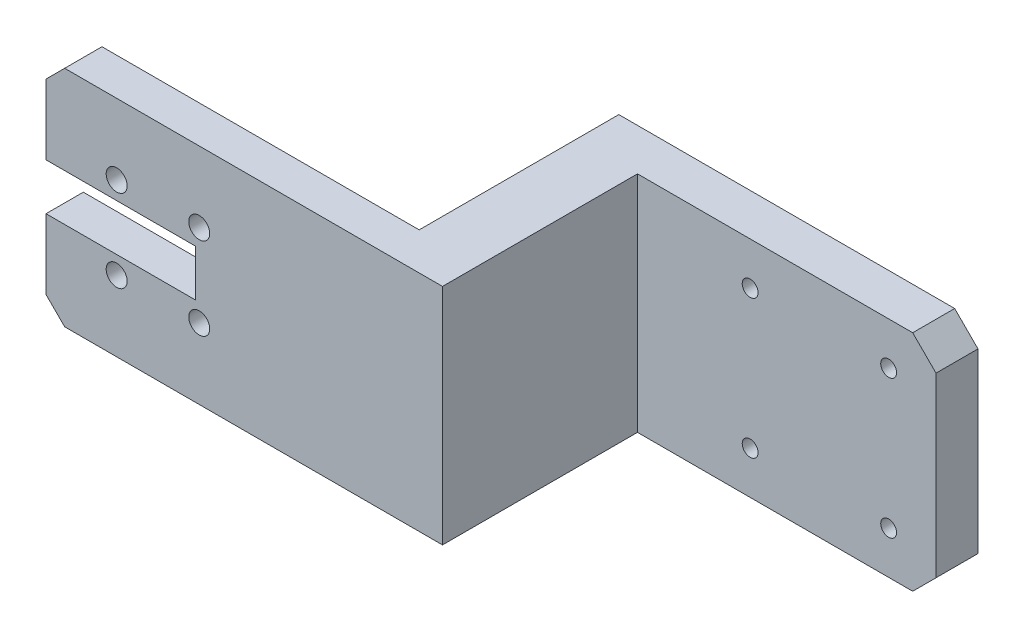
ISO-10303-21;
HEADER;
FILE_DESCRIPTION(('STEP AP214'),'2;1');
FILE_NAME('part.step','',(''),(''),'','','');
FILE_SCHEMA(('AUTOMOTIVE_DESIGN { 1 0 10303 214 1 1 1 1 }'));
ENDSEC;
DATA;
#1=APPLICATION_CONTEXT('core data for automotive mechanical design processes');
#2=APPLICATION_PROTOCOL_DEFINITION('international standard','automotive_design',2000,#1);
#3=PRODUCT_CONTEXT('',#1,'mechanical');
#4=PRODUCT('Part','Part','',(#3));
#5=PRODUCT_RELATED_PRODUCT_CATEGORY('part','',(#4));
#6=PRODUCT_DEFINITION_FORMATION('','',#4);
#7=PRODUCT_DEFINITION_CONTEXT('part definition',#1,'design');
#8=PRODUCT_DEFINITION('design','',#6,#7);
#9=PRODUCT_DEFINITION_SHAPE('','',#8);
#10=(LENGTH_UNIT() NAMED_UNIT(*) SI_UNIT(.MILLI.,.METRE.));
#11=(NAMED_UNIT(*) PLANE_ANGLE_UNIT() SI_UNIT($,.RADIAN.));
#12=(NAMED_UNIT(*) SI_UNIT($,.STERADIAN.) SOLID_ANGLE_UNIT());
#13=UNCERTAINTY_MEASURE_WITH_UNIT(LENGTH_MEASURE(1.E-05),#10,'distance_accuracy_value','');
#14=(GEOMETRIC_REPRESENTATION_CONTEXT(3) GLOBAL_UNCERTAINTY_ASSIGNED_CONTEXT((#13)) GLOBAL_UNIT_ASSIGNED_CONTEXT((#10,
#11,#12)) REPRESENTATION_CONTEXT('',''));
#15=CARTESIAN_POINT('',(0.,0.,0.));
#16=DIRECTION('',(0.,0.,1.));
#17=DIRECTION('',(1.,0.,0.));
#18=AXIS2_PLACEMENT_3D('',#15,#16,#17);
#19=CARTESIAN_POINT('',(0.,0.,0.));
#20=DIRECTION('',(0.,0.,1.));
#21=DIRECTION('',(1.,0.,0.));
#22=AXIS2_PLACEMENT_3D('',#19,#20,#21);
#23=PLANE('',#22);
#24=DIRECTION('',(0.,-1.,0.));
#25=VECTOR('',#24,1.);
#26=CARTESIAN_POINT('',(48.,24.,0.));
#27=LINE('',#26,#25);
#28=CARTESIAN_POINT('',(48.,24.,0.));
#29=VERTEX_POINT('',#28);
#30=CARTESIAN_POINT('',(48.,-24.,0.));
#31=VERTEX_POINT('',#30);
#32=EDGE_CURVE('E254',#29,#31,#27,.T.);
#33=ORIENTED_EDGE('',*,*,#32,.F.);
#34=DIRECTION('',(-1.,0.,0.));
#35=VECTOR('',#34,1.);
#36=CARTESIAN_POINT('',(120.,24.,0.));
#37=LINE('',#36,#35);
#38=CARTESIAN_POINT('',(120.,24.,0.));
#39=VERTEX_POINT('',#38);
#40=EDGE_CURVE('E60',#39,#29,#37,.T.);
#41=ORIENTED_EDGE('',*,*,#40,.F.);
#42=DIRECTION('',(-0.707106781186548,0.707106781186547,0.));
#43=VECTOR('',#42,1.);
#44=CARTESIAN_POINT('',(125.,19.,0.));
#45=LINE('',#44,#43);
#46=CARTESIAN_POINT('',(125.,19.,0.));
#47=VERTEX_POINT('',#46);
#48=EDGE_CURVE('E263',#47,#39,#45,.T.);
#49=ORIENTED_EDGE('',*,*,#48,.F.);
#50=DIRECTION('',(0.,1.,0.));
#51=VECTOR('',#50,1.);
#52=CARTESIAN_POINT('',(125.,-19.,0.));
#53=LINE('',#52,#51);
#54=CARTESIAN_POINT('',(125.,-19.,0.));
#55=VERTEX_POINT('',#54);
#56=EDGE_CURVE('E261',#55,#47,#53,.T.);
#57=ORIENTED_EDGE('',*,*,#56,.F.);
#58=DIRECTION('',(0.707106781186548,0.707106781186547,0.));
#59=VECTOR('',#58,1.);
#60=CARTESIAN_POINT('',(120.,-24.,0.));
#61=LINE('',#60,#59);
#62=CARTESIAN_POINT('',(120.,-24.,0.));
#63=VERTEX_POINT('',#62);
#64=EDGE_CURVE('E259',#63,#55,#61,.T.);
#65=ORIENTED_EDGE('',*,*,#64,.F.);
#66=DIRECTION('',(1.,0.,0.));
#67=VECTOR('',#66,1.);
#68=CARTESIAN_POINT('',(48.,-24.,0.));
#69=LINE('',#68,#67);
#70=EDGE_CURVE('E257',#31,#63,#69,.T.);
#71=ORIENTED_EDGE('',*,*,#70,.F.);
#72=EDGE_LOOP('',(#33,#41,#49,#57,#65,#71));
#73=FACE_BOUND('',#72,.T.);
#74=CARTESIAN_POINT('',(85.155,-14.845,0.));
#75=DIRECTION('',(0.,0.,1.));
#76=DIRECTION('',(1.,0.,0.));
#77=AXIS2_PLACEMENT_3D('',#74,#75,#76);
#78=CIRCLE('',#77,3.75);
#79=CARTESIAN_POINT('',(88.905,-14.845,0.));
#80=VERTEX_POINT('',#79);
#81=EDGE_CURVE('E249',#80,#80,#78,.T.);
#82=ORIENTED_EDGE('',*,*,#81,.T.);
#83=EDGE_LOOP('',(#82));
#84=FACE_BOUND('',#83,.T.);
#85=CARTESIAN_POINT('',(85.155,14.845,0.));
#86=DIRECTION('',(0.,0.,1.));
#87=DIRECTION('',(1.,0.,0.));
#88=AXIS2_PLACEMENT_3D('',#85,#86,#87);
#89=CIRCLE('',#88,3.75);
#90=CARTESIAN_POINT('',(88.905,14.845,0.));
#91=VERTEX_POINT('',#90);
#92=EDGE_CURVE('E244',#91,#91,#89,.T.);
#93=ORIENTED_EDGE('',*,*,#92,.T.);
#94=EDGE_LOOP('',(#93));
#95=FACE_BOUND('',#94,.T.);
#96=CARTESIAN_POINT('',(114.845,-14.845,0.));
#97=DIRECTION('',(0.,0.,1.));
#98=DIRECTION('',(1.,0.,0.));
#99=AXIS2_PLACEMENT_3D('',#96,#97,#98);
#100=CIRCLE('',#99,3.75);
#101=CARTESIAN_POINT('',(118.595,-14.845,0.));
#102=VERTEX_POINT('',#101);
#103=EDGE_CURVE('E237',#102,#102,#100,.T.);
#104=ORIENTED_EDGE('',*,*,#103,.T.);
#105=EDGE_LOOP('',(#104));
#106=FACE_BOUND('',#105,.T.);
#107=CARTESIAN_POINT('',(114.845,14.845,0.));
#108=DIRECTION('',(0.,0.,1.));
#109=DIRECTION('',(1.,0.,0.));
#110=AXIS2_PLACEMENT_3D('',#107,#108,#109);
#111=CIRCLE('',#110,3.75);
#112=CARTESIAN_POINT('',(118.595,14.845,0.));
#113=VERTEX_POINT('',#112);
#114=EDGE_CURVE('E234',#113,#113,#111,.T.);
#115=ORIENTED_EDGE('',*,*,#114,.T.);
#116=EDGE_LOOP('',(#115));
#117=FACE_BOUND('',#116,.T.);
#118=ADVANCED_FACE('F37',(#73,#84,#95,#106,#117),#23,.F.);
#119=CARTESIAN_POINT('',(48.,24.,4.));
#120=DIRECTION('',(1.,0.,0.));
#121=DIRECTION('',(0.,0.,-1.));
#122=AXIS2_PLACEMENT_3D('',#119,#120,#121);
#123=PLANE('',#122);
#124=ORIENTED_EDGE('',*,*,#32,.T.);
#125=DIRECTION('',(0.,0.,-1.));
#126=VECTOR('',#125,1.);
#127=CARTESIAN_POINT('',(48.,-24.,4.));
#128=LINE('',#127,#126);
#129=CARTESIAN_POINT('',(48.,-24.,42.8));
#130=VERTEX_POINT('',#129);
#131=EDGE_CURVE('E11',#130,#31,#128,.T.);
#132=ORIENTED_EDGE('',*,*,#131,.F.);
#133=DIRECTION('',(0.,-1.,0.));
#134=VECTOR('',#133,1.);
#135=CARTESIAN_POINT('',(48.,24.,42.8));
#136=LINE('',#135,#134);
#137=CARTESIAN_POINT('',(48.,24.,42.8));
#138=VERTEX_POINT('',#137);
#139=EDGE_CURVE('E179',#138,#130,#136,.T.);
#140=ORIENTED_EDGE('',*,*,#139,.F.);
#141=DIRECTION('',(0.,0.,-1.));
#142=VECTOR('',#141,1.);
#143=CARTESIAN_POINT('',(48.,24.,4.));
#144=LINE('',#143,#142);
#145=EDGE_CURVE('E266',#138,#29,#144,.T.);
#146=ORIENTED_EDGE('',*,*,#145,.T.);
#147=EDGE_LOOP('',(#124,#132,#140,#146));
#148=FACE_BOUND('',#147,.T.);
#149=ADVANCED_FACE('F39',(#148),#123,.F.);
#150=CARTESIAN_POINT('',(48.,-24.,4.));
#151=DIRECTION('',(0.,1.,0.));
#152=DIRECTION('',(0.,0.,1.));
#153=AXIS2_PLACEMENT_3D('',#150,#151,#152);
#154=PLANE('',#153);
#155=ORIENTED_EDGE('',*,*,#70,.T.);
#156=DIRECTION('',(0.,0.,-1.));
#157=VECTOR('',#156,1.);
#158=CARTESIAN_POINT('',(120.,-24.,4.));
#159=LINE('',#158,#157);
#160=CARTESIAN_POINT('',(120.,-24.,9.));
#161=VERTEX_POINT('',#160);
#162=EDGE_CURVE('E45',#161,#63,#159,.T.);
#163=ORIENTED_EDGE('',*,*,#162,.F.);
#164=DIRECTION('',(1.,0.,0.));
#165=VECTOR('',#164,1.);
#166=CARTESIAN_POINT('',(48.,-24.,9.));
#167=LINE('',#166,#165);
#168=CARTESIAN_POINT('',(61.,-24.,9.));
#169=VERTEX_POINT('',#168);
#170=EDGE_CURVE('E215',#169,#161,#167,.T.);
#171=ORIENTED_EDGE('',*,*,#170,.F.);
#172=DIRECTION('',(0.,0.,-1.));
#173=VECTOR('',#172,1.);
#174=CARTESIAN_POINT('',(61.,-24.,42.8));
#175=LINE('',#174,#173);
#176=CARTESIAN_POINT('',(61.,-24.,50.8));
#177=VERTEX_POINT('',#176);
#178=EDGE_CURVE('E190',#177,#169,#175,.T.);
#179=ORIENTED_EDGE('',*,*,#178,.F.);
#180=DIRECTION('',(1.,0.,0.));
#181=VECTOR('',#180,1.);
#182=CARTESIAN_POINT('',(-20.,-24.,50.8));
#183=LINE('',#182,#181);
#184=CARTESIAN_POINT('',(-20.,-24.,50.8));
#185=VERTEX_POINT('',#184);
#186=EDGE_CURVE('E162',#185,#177,#183,.T.);
#187=ORIENTED_EDGE('',*,*,#186,.F.);
#188=DIRECTION('',(0.,0.,-1.));
#189=VECTOR('',#188,1.);
#190=CARTESIAN_POINT('',(-20.,-24.,50.8));
#191=LINE('',#190,#189);
#192=CARTESIAN_POINT('',(-20.,-24.,42.8));
#193=VERTEX_POINT('',#192);
#194=EDGE_CURVE('E158',#185,#193,#191,.T.);
#195=ORIENTED_EDGE('',*,*,#194,.T.);
#196=DIRECTION('',(1.,0.,0.));
#197=VECTOR('',#196,1.);
#198=CARTESIAN_POINT('',(-20.,-24.,42.8));
#199=LINE('',#198,#197);
#200=EDGE_CURVE('E323',#193,#130,#199,.T.);
#201=ORIENTED_EDGE('',*,*,#200,.T.);
#202=ORIENTED_EDGE('',*,*,#131,.T.);
#203=EDGE_LOOP('',(#155,#163,#171,#179,#187,#195,#201,#202));
#204=FACE_BOUND('',#203,.T.);
#205=ADVANCED_FACE('F377',(#204),#154,.F.);
#206=CARTESIAN_POINT('',(120.,-24.,4.));
#207=DIRECTION('',(-0.707106781186547,0.707106781186548,0.));
#208=DIRECTION('',(-0.707106781186548,-0.707106781186547,0.));
#209=AXIS2_PLACEMENT_3D('',#206,#207,#208);
#210=PLANE('',#209);
#211=ORIENTED_EDGE('',*,*,#64,.T.);
#212=DIRECTION('',(0.,0.,-1.));
#213=VECTOR('',#212,1.);
#214=CARTESIAN_POINT('',(125.,-19.,4.));
#215=LINE('',#214,#213);
#216=CARTESIAN_POINT('',(125.,-19.,9.));
#217=VERTEX_POINT('',#216);
#218=EDGE_CURVE('E273',#217,#55,#215,.T.);
#219=ORIENTED_EDGE('',*,*,#218,.F.);
#220=DIRECTION('',(0.707106781186548,0.707106781186547,0.));
#221=VECTOR('',#220,1.);
#222=CARTESIAN_POINT('',(120.,-24.,9.));
#223=LINE('',#222,#221);
#224=EDGE_CURVE('E219',#161,#217,#223,.T.);
#225=ORIENTED_EDGE('',*,*,#224,.F.);
#226=ORIENTED_EDGE('',*,*,#162,.T.);
#227=EDGE_LOOP('',(#211,#219,#225,#226));
#228=FACE_BOUND('',#227,.T.);
#229=ADVANCED_FACE('F280',(#228),#210,.F.);
#230=CARTESIAN_POINT('',(125.,-19.,4.));
#231=DIRECTION('',(-1.,0.,0.));
#232=DIRECTION('',(0.,0.,1.));
#233=AXIS2_PLACEMENT_3D('',#230,#231,#232);
#234=PLANE('',#233);
#235=ORIENTED_EDGE('',*,*,#56,.T.);
#236=DIRECTION('',(0.,0.,-1.));
#237=VECTOR('',#236,1.);
#238=CARTESIAN_POINT('',(125.,19.,4.));
#239=LINE('',#238,#237);
#240=CARTESIAN_POINT('',(125.,19.,9.));
#241=VERTEX_POINT('',#240);
#242=EDGE_CURVE('E270',#241,#47,#239,.T.);
#243=ORIENTED_EDGE('',*,*,#242,.F.);
#244=DIRECTION('',(0.,1.,0.));
#245=VECTOR('',#244,1.);
#246=CARTESIAN_POINT('',(125.,-19.,9.));
#247=LINE('',#246,#245);
#248=EDGE_CURVE('E222',#217,#241,#247,.T.);
#249=ORIENTED_EDGE('',*,*,#248,.F.);
#250=ORIENTED_EDGE('',*,*,#218,.T.);
#251=EDGE_LOOP('',(#235,#243,#249,#250));
#252=FACE_BOUND('',#251,.T.);
#253=ADVANCED_FACE('F288',(#252),#234,.F.);
#254=CARTESIAN_POINT('',(125.,19.,4.));
#255=DIRECTION('',(-0.707106781186547,-0.707106781186548,0.));
#256=DIRECTION('',(0.707106781186548,-0.707106781186547,0.));
#257=AXIS2_PLACEMENT_3D('',#254,#255,#256);
#258=PLANE('',#257);
#259=ORIENTED_EDGE('',*,*,#48,.T.);
#260=DIRECTION('',(0.,0.,-1.));
#261=VECTOR('',#260,1.);
#262=CARTESIAN_POINT('',(120.,24.,4.));
#263=LINE('',#262,#261);
#264=CARTESIAN_POINT('',(120.,24.,9.));
#265=VERTEX_POINT('',#264);
#266=EDGE_CURVE('E268',#265,#39,#263,.T.);
#267=ORIENTED_EDGE('',*,*,#266,.F.);
#268=DIRECTION('',(-0.707106781186548,0.707106781186547,0.));
#269=VECTOR('',#268,1.);
#270=CARTESIAN_POINT('',(125.,19.,9.));
#271=LINE('',#270,#269);
#272=EDGE_CURVE('E225',#241,#265,#271,.T.);
#273=ORIENTED_EDGE('',*,*,#272,.F.);
#274=ORIENTED_EDGE('',*,*,#242,.T.);
#275=EDGE_LOOP('',(#259,#267,#273,#274));
#276=FACE_BOUND('',#275,.T.);
#277=ADVANCED_FACE('F292',(#276),#258,.F.);
#278=CARTESIAN_POINT('',(120.,24.,4.));
#279=DIRECTION('',(0.,-1.,0.));
#280=DIRECTION('',(0.,0.,-1.));
#281=AXIS2_PLACEMENT_3D('',#278,#279,#280);
#282=PLANE('',#281);
#283=ORIENTED_EDGE('',*,*,#40,.T.);
#284=ORIENTED_EDGE('',*,*,#145,.F.);
#285=DIRECTION('',(-1.,0.,0.));
#286=VECTOR('',#285,1.);
#287=CARTESIAN_POINT('',(61.,24.,42.8));
#288=LINE('',#287,#286);
#289=CARTESIAN_POINT('',(-20.,24.,42.8));
#290=VERTEX_POINT('',#289);
#291=EDGE_CURVE('E326',#138,#290,#288,.T.);
#292=ORIENTED_EDGE('',*,*,#291,.T.);
#293=DIRECTION('',(0.,0.,-1.));
#294=VECTOR('',#293,1.);
#295=CARTESIAN_POINT('',(-20.,24.,50.8));
#296=LINE('',#295,#294);
#297=CARTESIAN_POINT('',(-20.,24.,50.8));
#298=VERTEX_POINT('',#297);
#299=EDGE_CURVE('E181',#298,#290,#296,.T.);
#300=ORIENTED_EDGE('',*,*,#299,.F.);
#301=DIRECTION('',(-1.,0.,0.));
#302=VECTOR('',#301,1.);
#303=CARTESIAN_POINT('',(61.,24.,50.8));
#304=LINE('',#303,#302);
#305=CARTESIAN_POINT('',(61.,24.,50.8));
#306=VERTEX_POINT('',#305);
#307=EDGE_CURVE('E299',#306,#298,#304,.T.);
#308=ORIENTED_EDGE('',*,*,#307,.F.);
#309=DIRECTION('',(0.,0.,-1.));
#310=VECTOR('',#309,1.);
#311=CARTESIAN_POINT('',(61.,24.,42.8));
#312=LINE('',#311,#310);
#313=CARTESIAN_POINT('',(61.,24.,9.));
#314=VERTEX_POINT('',#313);
#315=EDGE_CURVE('E186',#306,#314,#312,.T.);
#316=ORIENTED_EDGE('',*,*,#315,.T.);
#317=DIRECTION('',(-1.,0.,0.));
#318=VECTOR('',#317,1.);
#319=CARTESIAN_POINT('',(120.,24.,9.));
#320=LINE('',#319,#318);
#321=EDGE_CURVE('E228',#265,#314,#320,.T.);
#322=ORIENTED_EDGE('',*,*,#321,.F.);
#323=ORIENTED_EDGE('',*,*,#266,.T.);
#324=EDGE_LOOP('',(#283,#284,#292,#300,#308,#316,#322,#323));
#325=FACE_BOUND('',#324,.T.);
#326=ADVANCED_FACE('F296',(#325),#282,.F.);
#327=CARTESIAN_POINT('',(85.155,-14.845,4.));
#328=DIRECTION('',(0.,0.,-1.));
#329=DIRECTION('',(-1.,0.,0.));
#330=AXIS2_PLACEMENT_3D('',#327,#328,#329);
#331=CYLINDRICAL_SURFACE('',#330,3.75);
#332=CARTESIAN_POINT('',(85.155,-14.845,4.));
#333=DIRECTION('',(0.,0.,1.));
#334=DIRECTION('',(1.,0.,0.));
#335=AXIS2_PLACEMENT_3D('',#332,#333,#334);
#336=CIRCLE('',#335,3.75);
#337=CARTESIAN_POINT('',(88.905,-14.845,4.));
#338=VERTEX_POINT('',#337);
#339=EDGE_CURVE('E241',#338,#338,#336,.T.);
#340=ORIENTED_EDGE('',*,*,#339,.T.);
#341=EDGE_LOOP('',(#340));
#342=FACE_BOUND('',#341,.T.);
#343=ORIENTED_EDGE('',*,*,#81,.F.);
#344=EDGE_LOOP('',(#343));
#345=FACE_BOUND('',#344,.T.);
#346=ADVANCED_FACE('F390',(#342,#345),#331,.F.);
#347=CARTESIAN_POINT('',(85.155,14.845,4.));
#348=DIRECTION('',(0.,0.,-1.));
#349=DIRECTION('',(-1.,0.,0.));
#350=AXIS2_PLACEMENT_3D('',#347,#348,#349);
#351=CYLINDRICAL_SURFACE('',#350,3.75);
#352=CARTESIAN_POINT('',(85.155,14.845,4.));
#353=DIRECTION('',(0.,0.,1.));
#354=DIRECTION('',(1.,0.,0.));
#355=AXIS2_PLACEMENT_3D('',#352,#353,#354);
#356=CIRCLE('',#355,3.75);
#357=CARTESIAN_POINT('',(88.905,14.845,4.));
#358=VERTEX_POINT('',#357);
#359=EDGE_CURVE('E233',#358,#358,#356,.T.);
#360=ORIENTED_EDGE('',*,*,#359,.T.);
#361=EDGE_LOOP('',(#360));
#362=FACE_BOUND('',#361,.T.);
#363=ORIENTED_EDGE('',*,*,#92,.F.);
#364=EDGE_LOOP('',(#363));
#365=FACE_BOUND('',#364,.T.);
#366=ADVANCED_FACE('F424',(#362,#365),#351,.F.);
#367=CARTESIAN_POINT('',(114.845,-14.845,4.));
#368=DIRECTION('',(0.,0.,-1.));
#369=DIRECTION('',(-1.,0.,0.));
#370=AXIS2_PLACEMENT_3D('',#367,#368,#369);
#371=CYLINDRICAL_SURFACE('',#370,3.75);
#372=CARTESIAN_POINT('',(114.845,-14.845,4.));
#373=DIRECTION('',(0.,0.,1.));
#374=DIRECTION('',(1.,0.,0.));
#375=AXIS2_PLACEMENT_3D('',#372,#373,#374);
#376=CIRCLE('',#375,3.75);
#377=CARTESIAN_POINT('',(118.595,-14.845,4.));
#378=VERTEX_POINT('',#377);
#379=EDGE_CURVE('E238',#378,#378,#376,.T.);
#380=ORIENTED_EDGE('',*,*,#379,.T.);
#381=EDGE_LOOP('',(#380));
#382=FACE_BOUND('',#381,.T.);
#383=ORIENTED_EDGE('',*,*,#103,.F.);
#384=EDGE_LOOP('',(#383));
#385=FACE_BOUND('',#384,.T.);
#386=ADVANCED_FACE('F431',(#382,#385),#371,.F.);
#387=CARTESIAN_POINT('',(114.845,14.845,4.));
#388=DIRECTION('',(0.,0.,-1.));
#389=DIRECTION('',(-1.,0.,0.));
#390=AXIS2_PLACEMENT_3D('',#387,#388,#389);
#391=CYLINDRICAL_SURFACE('',#390,3.75);
#392=CARTESIAN_POINT('',(114.845,14.845,4.));
#393=DIRECTION('',(0.,0.,1.));
#394=DIRECTION('',(1.,0.,0.));
#395=AXIS2_PLACEMENT_3D('',#392,#393,#394);
#396=CIRCLE('',#395,3.75);
#397=CARTESIAN_POINT('',(118.595,14.845,4.));
#398=VERTEX_POINT('',#397);
#399=EDGE_CURVE('E230',#398,#398,#396,.T.);
#400=ORIENTED_EDGE('',*,*,#399,.T.);
#401=EDGE_LOOP('',(#400));
#402=FACE_BOUND('',#401,.T.);
#403=ORIENTED_EDGE('',*,*,#114,.F.);
#404=EDGE_LOOP('',(#403));
#405=FACE_BOUND('',#404,.T.);
#406=ADVANCED_FACE('F438',(#402,#405),#391,.F.);
#407=CARTESIAN_POINT('',(0.,0.,4.));
#408=DIRECTION('',(0.,0.,1.));
#409=DIRECTION('',(1.,0.,0.));
#410=AXIS2_PLACEMENT_3D('',#407,#408,#409);
#411=PLANE('',#410);
#412=CARTESIAN_POINT('',(114.845,-14.845,4.));
#413=DIRECTION('',(0.,0.,1.));
#414=DIRECTION('',(1.,0.,0.));
#415=AXIS2_PLACEMENT_3D('',#412,#413,#414);
#416=CIRCLE('',#415,1.69999999999999);
#417=CARTESIAN_POINT('',(116.545,-14.845,4.));
#418=VERTEX_POINT('',#417);
#419=EDGE_CURVE('E197',#418,#418,#416,.T.);
#420=ORIENTED_EDGE('',*,*,#419,.T.);
#421=EDGE_LOOP('',(#420));
#422=FACE_BOUND('',#421,.T.);
#423=ORIENTED_EDGE('',*,*,#379,.F.);
#424=EDGE_LOOP('',(#423));
#425=FACE_BOUND('',#424,.T.);
#426=ADVANCED_FACE('F445',(#422,#425),#411,.F.);
#427=CARTESIAN_POINT('',(85.155,-14.845,4.));
#428=DIRECTION('',(0.,0.,1.));
#429=DIRECTION('',(1.,0.,0.));
#430=AXIS2_PLACEMENT_3D('',#427,#428,#429);
#431=CIRCLE('',#430,1.69999999999999);
#432=CARTESIAN_POINT('',(86.855,-14.845,4.));
#433=VERTEX_POINT('',#432);
#434=EDGE_CURVE('E209',#433,#433,#431,.T.);
#435=ORIENTED_EDGE('',*,*,#434,.T.);
#436=EDGE_LOOP('',(#435));
#437=FACE_BOUND('',#436,.T.);
#438=ORIENTED_EDGE('',*,*,#339,.F.);
#439=EDGE_LOOP('',(#438));
#440=FACE_BOUND('',#439,.T.);
#441=ADVANCED_FACE('F452',(#437,#440),#411,.F.);
#442=CARTESIAN_POINT('',(85.155,14.845,4.));
#443=DIRECTION('',(0.,0.,1.));
#444=DIRECTION('',(1.,0.,0.));
#445=AXIS2_PLACEMENT_3D('',#442,#443,#444);
#446=CIRCLE('',#445,1.69999999999999);
#447=CARTESIAN_POINT('',(86.855,14.845,4.));
#448=VERTEX_POINT('',#447);
#449=EDGE_CURVE('E203',#448,#448,#446,.T.);
#450=ORIENTED_EDGE('',*,*,#449,.T.);
#451=EDGE_LOOP('',(#450));
#452=FACE_BOUND('',#451,.T.);
#453=ORIENTED_EDGE('',*,*,#359,.F.);
#454=EDGE_LOOP('',(#453));
#455=FACE_BOUND('',#454,.T.);
#456=ADVANCED_FACE('F461',(#452,#455),#411,.F.);
#457=CARTESIAN_POINT('',(114.845,14.845,4.));
#458=DIRECTION('',(0.,0.,1.));
#459=DIRECTION('',(1.,0.,0.));
#460=AXIS2_PLACEMENT_3D('',#457,#458,#459);
#461=CIRCLE('',#460,1.69999999999999);
#462=CARTESIAN_POINT('',(116.545,14.845,4.));
#463=VERTEX_POINT('',#462);
#464=EDGE_CURVE('E193',#463,#463,#461,.T.);
#465=ORIENTED_EDGE('',*,*,#464,.T.);
#466=EDGE_LOOP('',(#465));
#467=FACE_BOUND('',#466,.T.);
#468=ORIENTED_EDGE('',*,*,#399,.F.);
#469=EDGE_LOOP('',(#468));
#470=FACE_BOUND('',#469,.T.);
#471=ADVANCED_FACE('F455',(#467,#470),#411,.F.);
#472=CARTESIAN_POINT('',(0.,0.,9.));
#473=DIRECTION('',(0.,0.,1.));
#474=DIRECTION('',(1.,0.,0.));
#475=AXIS2_PLACEMENT_3D('',#472,#473,#474);
#476=PLANE('',#475);
#477=DIRECTION('',(0.,1.,0.));
#478=VECTOR('',#477,1.);
#479=CARTESIAN_POINT('',(61.,-24.,9.));
#480=LINE('',#479,#478);
#481=EDGE_CURVE('E52',#169,#314,#480,.T.);
#482=ORIENTED_EDGE('',*,*,#481,.F.);
#483=ORIENTED_EDGE('',*,*,#170,.T.);
#484=ORIENTED_EDGE('',*,*,#224,.T.);
#485=ORIENTED_EDGE('',*,*,#248,.T.);
#486=ORIENTED_EDGE('',*,*,#272,.T.);
#487=ORIENTED_EDGE('',*,*,#321,.T.);
#488=EDGE_LOOP('',(#482,#483,#484,#485,#486,#487));
#489=FACE_BOUND('',#488,.T.);
#490=CARTESIAN_POINT('',(114.845,-14.845,9.));
#491=DIRECTION('',(0.,0.,1.));
#492=DIRECTION('',(1.,0.,0.));
#493=AXIS2_PLACEMENT_3D('',#490,#491,#492);
#494=CIRCLE('',#493,1.69999999999999);
#495=CARTESIAN_POINT('',(116.545,-14.845,9.));
#496=VERTEX_POINT('',#495);
#497=EDGE_CURVE('E200',#496,#496,#494,.T.);
#498=ORIENTED_EDGE('',*,*,#497,.F.);
#499=EDGE_LOOP('',(#498));
#500=FACE_BOUND('',#499,.T.);
#501=CARTESIAN_POINT('',(85.155,-14.845,9.));
#502=DIRECTION('',(0.,0.,1.));
#503=DIRECTION('',(1.,0.,0.));
#504=AXIS2_PLACEMENT_3D('',#501,#502,#503);
#505=CIRCLE('',#504,1.69999999999999);
#506=CARTESIAN_POINT('',(86.855,-14.845,9.));
#507=VERTEX_POINT('',#506);
#508=EDGE_CURVE('E212',#507,#507,#505,.T.);
#509=ORIENTED_EDGE('',*,*,#508,.F.);
#510=EDGE_LOOP('',(#509));
#511=FACE_BOUND('',#510,.T.);
#512=CARTESIAN_POINT('',(85.155,14.845,9.));
#513=DIRECTION('',(0.,0.,1.));
#514=DIRECTION('',(1.,0.,0.));
#515=AXIS2_PLACEMENT_3D('',#512,#513,#514);
#516=CIRCLE('',#515,1.69999999999999);
#517=CARTESIAN_POINT('',(86.855,14.845,9.));
#518=VERTEX_POINT('',#517);
#519=EDGE_CURVE('E206',#518,#518,#516,.T.);
#520=ORIENTED_EDGE('',*,*,#519,.F.);
#521=EDGE_LOOP('',(#520));
#522=FACE_BOUND('',#521,.T.);
#523=CARTESIAN_POINT('',(114.845,14.845,9.));
#524=DIRECTION('',(0.,0.,1.));
#525=DIRECTION('',(1.,0.,0.));
#526=AXIS2_PLACEMENT_3D('',#523,#524,#525);
#527=CIRCLE('',#526,1.69999999999999);
#528=CARTESIAN_POINT('',(116.545,14.845,9.));
#529=VERTEX_POINT('',#528);
#530=EDGE_CURVE('E194',#529,#529,#527,.T.);
#531=ORIENTED_EDGE('',*,*,#530,.F.);
#532=EDGE_LOOP('',(#531));
#533=FACE_BOUND('',#532,.T.);
#534=ADVANCED_FACE('F294',(#489,#500,#511,#522,#533),#476,.T.);
#535=CARTESIAN_POINT('',(85.155,-14.845,9.));
#536=DIRECTION('',(0.,0.,-1.));
#537=DIRECTION('',(-1.,0.,0.));
#538=AXIS2_PLACEMENT_3D('',#535,#536,#537);
#539=CYLINDRICAL_SURFACE('',#538,1.69999999999999);
#540=ORIENTED_EDGE('',*,*,#508,.T.);
#541=EDGE_LOOP('',(#540));
#542=FACE_BOUND('',#541,.T.);
#543=ORIENTED_EDGE('',*,*,#434,.F.);
#544=EDGE_LOOP('',(#543));
#545=FACE_BOUND('',#544,.T.);
#546=ADVANCED_FACE('F481',(#542,#545),#539,.F.);
#547=CARTESIAN_POINT('',(85.155,14.845,9.));
#548=DIRECTION('',(0.,0.,-1.));
#549=DIRECTION('',(-1.,0.,0.));
#550=AXIS2_PLACEMENT_3D('',#547,#548,#549);
#551=CYLINDRICAL_SURFACE('',#550,1.69999999999999);
#552=ORIENTED_EDGE('',*,*,#519,.T.);
#553=EDGE_LOOP('',(#552));
#554=FACE_BOUND('',#553,.T.);
#555=ORIENTED_EDGE('',*,*,#449,.F.);
#556=EDGE_LOOP('',(#555));
#557=FACE_BOUND('',#556,.T.);
#558=ADVANCED_FACE('F488',(#554,#557),#551,.F.);
#559=CARTESIAN_POINT('',(114.845,-14.845,9.));
#560=DIRECTION('',(0.,0.,-1.));
#561=DIRECTION('',(-1.,0.,0.));
#562=AXIS2_PLACEMENT_3D('',#559,#560,#561);
#563=CYLINDRICAL_SURFACE('',#562,1.69999999999999);
#564=ORIENTED_EDGE('',*,*,#497,.T.);
#565=EDGE_LOOP('',(#564));
#566=FACE_BOUND('',#565,.T.);
#567=ORIENTED_EDGE('',*,*,#419,.F.);
#568=EDGE_LOOP('',(#567));
#569=FACE_BOUND('',#568,.T.);
#570=ADVANCED_FACE('F496',(#566,#569),#563,.F.);
#571=CARTESIAN_POINT('',(114.845,14.845,9.));
#572=DIRECTION('',(0.,0.,-1.));
#573=DIRECTION('',(-1.,0.,0.));
#574=AXIS2_PLACEMENT_3D('',#571,#572,#573);
#575=CYLINDRICAL_SURFACE('',#574,1.69999999999999);
#576=ORIENTED_EDGE('',*,*,#530,.T.);
#577=EDGE_LOOP('',(#576));
#578=FACE_BOUND('',#577,.T.);
#579=ORIENTED_EDGE('',*,*,#464,.F.);
#580=EDGE_LOOP('',(#579));
#581=FACE_BOUND('',#580,.T.);
#582=ADVANCED_FACE('F504',(#578,#581),#575,.F.);
#583=CARTESIAN_POINT('',(61.,-24.,42.8));
#584=DIRECTION('',(-1.,0.,0.));
#585=DIRECTION('',(0.,0.,1.));
#586=AXIS2_PLACEMENT_3D('',#583,#584,#585);
#587=PLANE('',#586);
#588=ORIENTED_EDGE('',*,*,#481,.T.);
#589=ORIENTED_EDGE('',*,*,#315,.F.);
#590=DIRECTION('',(0.,1.,0.));
#591=VECTOR('',#590,1.);
#592=CARTESIAN_POINT('',(61.,-24.,50.8));
#593=LINE('',#592,#591);
#594=EDGE_CURVE('E304',#177,#306,#593,.T.);
#595=ORIENTED_EDGE('',*,*,#594,.F.);
#596=ORIENTED_EDGE('',*,*,#178,.T.);
#597=EDGE_LOOP('',(#588,#589,#595,#596));
#598=FACE_BOUND('',#597,.T.);
#599=ADVANCED_FACE('F303',(#598),#587,.F.);
#600=CARTESIAN_POINT('',(0.,0.,42.8));
#601=DIRECTION('',(0.,0.,1.));
#602=DIRECTION('',(1.,0.,0.));
#603=AXIS2_PLACEMENT_3D('',#600,#601,#602);
#604=PLANE('',#603);
#605=CARTESIAN_POINT('',(-8.85,-8.85,42.8));
#606=DIRECTION('',(0.,0.,1.));
#607=DIRECTION('',(1.,0.,0.));
#608=AXIS2_PLACEMENT_3D('',#605,#606,#607);
#609=CIRCLE('',#608,2.25);
#610=CARTESIAN_POINT('',(-6.6,-8.85,42.8));
#611=VERTEX_POINT('',#610);
#612=EDGE_CURVE('E738',#611,#611,#609,.T.);
#613=ORIENTED_EDGE('',*,*,#612,.T.);
#614=EDGE_LOOP('',(#613));
#615=FACE_BOUND('',#614,.T.);
#616=CARTESIAN_POINT('',(-8.85,8.85,42.8));
#617=DIRECTION('',(0.,0.,1.));
#618=DIRECTION('',(1.,0.,0.));
#619=AXIS2_PLACEMENT_3D('',#616,#617,#618);
#620=CIRCLE('',#619,2.25);
#621=CARTESIAN_POINT('',(-6.6,8.85,42.8));
#622=VERTEX_POINT('',#621);
#623=EDGE_CURVE('E732',#622,#622,#620,.T.);
#624=ORIENTED_EDGE('',*,*,#623,.T.);
#625=EDGE_LOOP('',(#624));
#626=FACE_BOUND('',#625,.T.);
#627=CARTESIAN_POINT('',(8.85,-8.85,42.8));
#628=DIRECTION('',(0.,0.,1.));
#629=DIRECTION('',(1.,0.,0.));
#630=AXIS2_PLACEMENT_3D('',#627,#628,#629);
#631=CIRCLE('',#630,2.25);
#632=CARTESIAN_POINT('',(11.1,-8.85,42.8));
#633=VERTEX_POINT('',#632);
#634=EDGE_CURVE('E726',#633,#633,#631,.T.);
#635=ORIENTED_EDGE('',*,*,#634,.T.);
#636=EDGE_LOOP('',(#635));
#637=FACE_BOUND('',#636,.T.);
#638=CARTESIAN_POINT('',(8.85,8.85,42.8));
#639=DIRECTION('',(0.,0.,1.));
#640=DIRECTION('',(1.,0.,0.));
#641=AXIS2_PLACEMENT_3D('',#638,#639,#640);
#642=CIRCLE('',#641,2.25);
#643=CARTESIAN_POINT('',(11.1,8.85,42.8));
#644=VERTEX_POINT('',#643);
#645=EDGE_CURVE('E723',#644,#644,#642,.T.);
#646=ORIENTED_EDGE('',*,*,#645,.T.);
#647=EDGE_LOOP('',(#646));
#648=FACE_BOUND('',#647,.T.);
#649=ORIENTED_EDGE('',*,*,#291,.F.);
#650=ORIENTED_EDGE('',*,*,#139,.T.);
#651=ORIENTED_EDGE('',*,*,#200,.F.);
#652=DIRECTION('',(0.707106781186548,-0.707106781186548,0.));
#653=VECTOR('',#652,1.);
#654=CARTESIAN_POINT('',(-24.,-20.,42.8));
#655=LINE('',#654,#653);
#656=CARTESIAN_POINT('',(-24.,-20.,42.8));
#657=VERTEX_POINT('',#656);
#658=EDGE_CURVE('E320',#657,#193,#655,.T.);
#659=ORIENTED_EDGE('',*,*,#658,.F.);
#660=DIRECTION('',(0.,-1.,0.));
#661=VECTOR('',#660,1.);
#662=CARTESIAN_POINT('',(-24.,-5.,42.8));
#663=LINE('',#662,#661);
#664=CARTESIAN_POINT('',(-24.,-5.,42.8));
#665=VERTEX_POINT('',#664);
#666=EDGE_CURVE('E177',#665,#657,#663,.T.);
#667=ORIENTED_EDGE('',*,*,#666,.F.);
#668=DIRECTION('',(-1.,0.,0.));
#669=VECTOR('',#668,1.);
#670=CARTESIAN_POINT('',(8.,-5.,42.8));
#671=LINE('',#670,#669);
#672=CARTESIAN_POINT('',(8.,-5.,42.8));
#673=VERTEX_POINT('',#672);
#674=EDGE_CURVE('E173',#673,#665,#671,.T.);
#675=ORIENTED_EDGE('',*,*,#674,.F.);
#676=DIRECTION('',(0.,-1.,0.));
#677=VECTOR('',#676,1.);
#678=CARTESIAN_POINT('',(8.,5.,42.8));
#679=LINE('',#678,#677);
#680=CARTESIAN_POINT('',(8.,5.,42.8));
#681=VERTEX_POINT('',#680);
#682=EDGE_CURVE('E334',#681,#673,#679,.T.);
#683=ORIENTED_EDGE('',*,*,#682,.F.);
#684=DIRECTION('',(1.,0.,0.));
#685=VECTOR('',#684,1.);
#686=CARTESIAN_POINT('',(-24.,5.,42.8));
#687=LINE('',#686,#685);
#688=CARTESIAN_POINT('',(-24.,5.,42.8));
#689=VERTEX_POINT('',#688);
#690=EDGE_CURVE('E332',#689,#681,#687,.T.);
#691=ORIENTED_EDGE('',*,*,#690,.F.);
#692=DIRECTION('',(0.,-1.,0.));
#693=VECTOR('',#692,1.);
#694=CARTESIAN_POINT('',(-24.,20.,42.8));
#695=LINE('',#694,#693);
#696=CARTESIAN_POINT('',(-24.,20.,42.8));
#697=VERTEX_POINT('',#696);
#698=EDGE_CURVE('E330',#697,#689,#695,.T.);
#699=ORIENTED_EDGE('',*,*,#698,.F.);
#700=DIRECTION('',(-0.707106781186548,-0.707106781186548,0.));
#701=VECTOR('',#700,1.);
#702=CARTESIAN_POINT('',(-20.,24.,42.8));
#703=LINE('',#702,#701);
#704=EDGE_CURVE('E328',#290,#697,#703,.T.);
#705=ORIENTED_EDGE('',*,*,#704,.F.);
#706=EDGE_LOOP('',(#649,#650,#651,#659,#667,#675,#683,#691,#699,#705));
#707=FACE_BOUND('',#706,.T.);
#708=ADVANCED_FACE('F358',(#615,#626,#637,#648,#707),#604,.F.);
#709=CARTESIAN_POINT('',(0.,0.,50.8));
#710=DIRECTION('',(0.,0.,1.));
#711=DIRECTION('',(1.,0.,0.));
#712=AXIS2_PLACEMENT_3D('',#709,#710,#711);
#713=PLANE('',#712);
#714=CARTESIAN_POINT('',(8.85,-8.85,50.8));
#715=DIRECTION('',(0.,0.,1.));
#716=DIRECTION('',(1.,0.,0.));
#717=AXIS2_PLACEMENT_3D('',#714,#715,#716);
#718=CIRCLE('',#717,2.25);
#719=CARTESIAN_POINT('',(11.1,-8.85,50.8));
#720=VERTEX_POINT('',#719);
#721=EDGE_CURVE('E729',#720,#720,#718,.T.);
#722=ORIENTED_EDGE('',*,*,#721,.F.);
#723=EDGE_LOOP('',(#722));
#724=FACE_BOUND('',#723,.T.);
#725=CARTESIAN_POINT('',(-8.85,-8.85,50.8));
#726=DIRECTION('',(0.,0.,1.));
#727=DIRECTION('',(1.,0.,0.));
#728=AXIS2_PLACEMENT_3D('',#725,#726,#727);
#729=CIRCLE('',#728,2.25);
#730=CARTESIAN_POINT('',(-6.6,-8.85,50.8));
#731=VERTEX_POINT('',#730);
#732=EDGE_CURVE('E321',#731,#731,#729,.T.);
#733=ORIENTED_EDGE('',*,*,#732,.F.);
#734=EDGE_LOOP('',(#733));
#735=FACE_BOUND('',#734,.T.);
#736=DIRECTION('',(0.,-1.,0.));
#737=VECTOR('',#736,1.);
#738=CARTESIAN_POINT('',(-24.,-5.,50.8));
#739=LINE('',#738,#737);
#740=CARTESIAN_POINT('',(-24.,-5.,50.8));
#741=VERTEX_POINT('',#740);
#742=CARTESIAN_POINT('',(-24.,-20.,50.8));
#743=VERTEX_POINT('',#742);
#744=EDGE_CURVE('E163',#741,#743,#739,.T.);
#745=ORIENTED_EDGE('',*,*,#744,.T.);
#746=DIRECTION('',(0.707106781186548,-0.707106781186548,0.));
#747=VECTOR('',#746,1.);
#748=CARTESIAN_POINT('',(-24.,-20.,50.8));
#749=LINE('',#748,#747);
#750=EDGE_CURVE('E151',#743,#185,#749,.T.);
#751=ORIENTED_EDGE('',*,*,#750,.T.);
#752=ORIENTED_EDGE('',*,*,#186,.T.);
#753=ORIENTED_EDGE('',*,*,#594,.T.);
#754=ORIENTED_EDGE('',*,*,#307,.T.);
#755=DIRECTION('',(-0.707106781186548,-0.707106781186548,0.));
#756=VECTOR('',#755,1.);
#757=CARTESIAN_POINT('',(-20.,24.,50.8));
#758=LINE('',#757,#756);
#759=CARTESIAN_POINT('',(-24.,20.,50.8));
#760=VERTEX_POINT('',#759);
#761=EDGE_CURVE('E306',#298,#760,#758,.T.);
#762=ORIENTED_EDGE('',*,*,#761,.T.);
#763=DIRECTION('',(0.,-1.,0.));
#764=VECTOR('',#763,1.);
#765=CARTESIAN_POINT('',(-24.,20.,50.8));
#766=LINE('',#765,#764);
#767=CARTESIAN_POINT('',(-24.,5.,50.8));
#768=VERTEX_POINT('',#767);
#769=EDGE_CURVE('E311',#760,#768,#766,.T.);
#770=ORIENTED_EDGE('',*,*,#769,.T.);
#771=DIRECTION('',(1.,0.,0.));
#772=VECTOR('',#771,1.);
#773=CARTESIAN_POINT('',(-24.,5.,50.8));
#774=LINE('',#773,#772);
#775=CARTESIAN_POINT('',(8.,5.,50.8));
#776=VERTEX_POINT('',#775);
#777=EDGE_CURVE('E313',#768,#776,#774,.T.);
#778=ORIENTED_EDGE('',*,*,#777,.T.);
#779=DIRECTION('',(0.,-1.,0.));
#780=VECTOR('',#779,1.);
#781=CARTESIAN_POINT('',(8.,5.,50.8));
#782=LINE('',#781,#780);
#783=CARTESIAN_POINT('',(8.,-5.,50.8));
#784=VERTEX_POINT('',#783);
#785=EDGE_CURVE('E315',#776,#784,#782,.T.);
#786=ORIENTED_EDGE('',*,*,#785,.T.);
#787=DIRECTION('',(-1.,0.,0.));
#788=VECTOR('',#787,1.);
#789=CARTESIAN_POINT('',(8.,-5.,50.8));
#790=LINE('',#789,#788);
#791=EDGE_CURVE('E169',#784,#741,#790,.T.);
#792=ORIENTED_EDGE('',*,*,#791,.T.);
#793=EDGE_LOOP('',(#745,#751,#752,#753,#754,#762,#770,#778,#786,#792));
#794=FACE_BOUND('',#793,.T.);
#795=CARTESIAN_POINT('',(-8.85,8.85,50.8));
#796=DIRECTION('',(0.,0.,1.));
#797=DIRECTION('',(1.,0.,0.));
#798=AXIS2_PLACEMENT_3D('',#795,#796,#797);
#799=CIRCLE('',#798,2.25);
#800=CARTESIAN_POINT('',(-6.6,8.85,50.8));
#801=VERTEX_POINT('',#800);
#802=EDGE_CURVE('E735',#801,#801,#799,.T.);
#803=ORIENTED_EDGE('',*,*,#802,.F.);
#804=EDGE_LOOP('',(#803));
#805=FACE_BOUND('',#804,.T.);
#806=CARTESIAN_POINT('',(8.85,8.85,50.8));
#807=DIRECTION('',(0.,0.,1.));
#808=DIRECTION('',(1.,0.,0.));
#809=AXIS2_PLACEMENT_3D('',#806,#807,#808);
#810=CIRCLE('',#809,2.25);
#811=CARTESIAN_POINT('',(11.1,8.85,50.8));
#812=VERTEX_POINT('',#811);
#813=EDGE_CURVE('E720',#812,#812,#810,.T.);
#814=ORIENTED_EDGE('',*,*,#813,.F.);
#815=EDGE_LOOP('',(#814));
#816=FACE_BOUND('',#815,.T.);
#817=ADVANCED_FACE('F166',(#724,#735,#794,#805,#816),#713,.T.);
#818=CARTESIAN_POINT('',(-24.,-5.,50.8));
#819=DIRECTION('',(1.,0.,0.));
#820=DIRECTION('',(0.,0.,-1.));
#821=AXIS2_PLACEMENT_3D('',#818,#819,#820);
#822=PLANE('',#821);
#823=ORIENTED_EDGE('',*,*,#666,.T.);
#824=DIRECTION('',(0.,0.,-1.));
#825=VECTOR('',#824,1.);
#826=CARTESIAN_POINT('',(-24.,-20.,50.8));
#827=LINE('',#826,#825);
#828=EDGE_CURVE('E155',#743,#657,#827,.T.);
#829=ORIENTED_EDGE('',*,*,#828,.F.);
#830=ORIENTED_EDGE('',*,*,#744,.F.);
#831=DIRECTION('',(0.,0.,-1.));
#832=VECTOR('',#831,1.);
#833=CARTESIAN_POINT('',(-24.,-5.,50.8));
#834=LINE('',#833,#832);
#835=EDGE_CURVE('E318',#741,#665,#834,.T.);
#836=ORIENTED_EDGE('',*,*,#835,.T.);
#837=EDGE_LOOP('',(#823,#829,#830,#836));
#838=FACE_BOUND('',#837,.T.);
#839=ADVANCED_FACE('F175',(#838),#822,.F.);
#840=CARTESIAN_POINT('',(-24.,-20.,50.8));
#841=DIRECTION('',(0.707106781186547,0.707106781186547,0.));
#842=DIRECTION('',(-0.707106781186548,0.707106781186548,0.));
#843=AXIS2_PLACEMENT_3D('',#840,#841,#842);
#844=PLANE('',#843);
#845=ORIENTED_EDGE('',*,*,#658,.T.);
#846=ORIENTED_EDGE('',*,*,#194,.F.);
#847=ORIENTED_EDGE('',*,*,#750,.F.);
#848=ORIENTED_EDGE('',*,*,#828,.T.);
#849=EDGE_LOOP('',(#845,#846,#847,#848));
#850=FACE_BOUND('',#849,.T.);
#851=ADVANCED_FACE('F153',(#850),#844,.F.);
#852=CARTESIAN_POINT('',(-20.,24.,50.8));
#853=DIRECTION('',(0.707106781186547,-0.707106781186547,0.));
#854=DIRECTION('',(0.707106781186548,0.707106781186548,0.));
#855=AXIS2_PLACEMENT_3D('',#852,#853,#854);
#856=PLANE('',#855);
#857=ORIENTED_EDGE('',*,*,#704,.T.);
#858=DIRECTION('',(0.,0.,-1.));
#859=VECTOR('',#858,1.);
#860=CARTESIAN_POINT('',(-24.,20.,50.8));
#861=LINE('',#860,#859);
#862=EDGE_CURVE('E347',#760,#697,#861,.T.);
#863=ORIENTED_EDGE('',*,*,#862,.F.);
#864=ORIENTED_EDGE('',*,*,#761,.F.);
#865=ORIENTED_EDGE('',*,*,#299,.T.);
#866=EDGE_LOOP('',(#857,#863,#864,#865));
#867=FACE_BOUND('',#866,.T.);
#868=ADVANCED_FACE('F353',(#867),#856,.F.);
#869=CARTESIAN_POINT('',(-24.,20.,50.8));
#870=DIRECTION('',(1.,0.,0.));
#871=DIRECTION('',(0.,0.,-1.));
#872=AXIS2_PLACEMENT_3D('',#869,#870,#871);
#873=PLANE('',#872);
#874=ORIENTED_EDGE('',*,*,#698,.T.);
#875=DIRECTION('',(0.,0.,-1.));
#876=VECTOR('',#875,1.);
#877=CARTESIAN_POINT('',(-24.,5.,50.8));
#878=LINE('',#877,#876);
#879=EDGE_CURVE('E344',#768,#689,#878,.T.);
#880=ORIENTED_EDGE('',*,*,#879,.F.);
#881=ORIENTED_EDGE('',*,*,#769,.F.);
#882=ORIENTED_EDGE('',*,*,#862,.T.);
#883=EDGE_LOOP('',(#874,#880,#881,#882));
#884=FACE_BOUND('',#883,.T.);
#885=ADVANCED_FACE('F363',(#884),#873,.F.);
#886=CARTESIAN_POINT('',(-24.,5.,50.8));
#887=DIRECTION('',(0.,1.,0.));
#888=DIRECTION('',(0.,0.,1.));
#889=AXIS2_PLACEMENT_3D('',#886,#887,#888);
#890=PLANE('',#889);
#891=ORIENTED_EDGE('',*,*,#690,.T.);
#892=DIRECTION('',(0.,0.,-1.));
#893=VECTOR('',#892,1.);
#894=CARTESIAN_POINT('',(8.,5.,50.8));
#895=LINE('',#894,#893);
#896=EDGE_CURVE('E341',#776,#681,#895,.T.);
#897=ORIENTED_EDGE('',*,*,#896,.F.);
#898=ORIENTED_EDGE('',*,*,#777,.F.);
#899=ORIENTED_EDGE('',*,*,#879,.T.);
#900=EDGE_LOOP('',(#891,#897,#898,#899));
#901=FACE_BOUND('',#900,.T.);
#902=ADVANCED_FACE('F367',(#901),#890,.F.);
#903=CARTESIAN_POINT('',(8.,5.,50.8));
#904=DIRECTION('',(1.,0.,0.));
#905=DIRECTION('',(0.,0.,-1.));
#906=AXIS2_PLACEMENT_3D('',#903,#904,#905);
#907=PLANE('',#906);
#908=ORIENTED_EDGE('',*,*,#682,.T.);
#909=DIRECTION('',(0.,0.,-1.));
#910=VECTOR('',#909,1.);
#911=CARTESIAN_POINT('',(8.,-5.,50.8));
#912=LINE('',#911,#910);
#913=EDGE_CURVE('E338',#784,#673,#912,.T.);
#914=ORIENTED_EDGE('',*,*,#913,.F.);
#915=ORIENTED_EDGE('',*,*,#785,.F.);
#916=ORIENTED_EDGE('',*,*,#896,.T.);
#917=EDGE_LOOP('',(#908,#914,#915,#916));
#918=FACE_BOUND('',#917,.T.);
#919=ADVANCED_FACE('F372',(#918),#907,.F.);
#920=CARTESIAN_POINT('',(8.,-5.,50.8));
#921=DIRECTION('',(0.,-1.,0.));
#922=DIRECTION('',(0.,0.,-1.));
#923=AXIS2_PLACEMENT_3D('',#920,#921,#922);
#924=PLANE('',#923);
#925=ORIENTED_EDGE('',*,*,#674,.T.);
#926=ORIENTED_EDGE('',*,*,#835,.F.);
#927=ORIENTED_EDGE('',*,*,#791,.F.);
#928=ORIENTED_EDGE('',*,*,#913,.T.);
#929=EDGE_LOOP('',(#925,#926,#927,#928));
#930=FACE_BOUND('',#929,.T.);
#931=ADVANCED_FACE('F375',(#930),#924,.F.);
#932=CARTESIAN_POINT('',(-8.85,-8.85,50.8));
#933=DIRECTION('',(0.,0.,-1.));
#934=DIRECTION('',(-1.,0.,0.));
#935=AXIS2_PLACEMENT_3D('',#932,#933,#934);
#936=CYLINDRICAL_SURFACE('',#935,2.25);
#937=ORIENTED_EDGE('',*,*,#732,.T.);
#938=EDGE_LOOP('',(#937));
#939=FACE_BOUND('',#938,.T.);
#940=ORIENTED_EDGE('',*,*,#612,.F.);
#941=EDGE_LOOP('',(#940));
#942=FACE_BOUND('',#941,.T.);
#943=ADVANCED_FACE('F573',(#939,#942),#936,.F.);
#944=CARTESIAN_POINT('',(-8.85,8.85,50.8));
#945=DIRECTION('',(0.,0.,-1.));
#946=DIRECTION('',(-1.,0.,0.));
#947=AXIS2_PLACEMENT_3D('',#944,#945,#946);
#948=CYLINDRICAL_SURFACE('',#947,2.25);
#949=ORIENTED_EDGE('',*,*,#802,.T.);
#950=EDGE_LOOP('',(#949));
#951=FACE_BOUND('',#950,.T.);
#952=ORIENTED_EDGE('',*,*,#623,.F.);
#953=EDGE_LOOP('',(#952));
#954=FACE_BOUND('',#953,.T.);
#955=ADVANCED_FACE('F580',(#951,#954),#948,.F.);
#956=CARTESIAN_POINT('',(8.85,-8.85,50.8));
#957=DIRECTION('',(0.,0.,-1.));
#958=DIRECTION('',(-1.,0.,0.));
#959=AXIS2_PLACEMENT_3D('',#956,#957,#958);
#960=CYLINDRICAL_SURFACE('',#959,2.25);
#961=ORIENTED_EDGE('',*,*,#721,.T.);
#962=EDGE_LOOP('',(#961));
#963=FACE_BOUND('',#962,.T.);
#964=ORIENTED_EDGE('',*,*,#634,.F.);
#965=EDGE_LOOP('',(#964));
#966=FACE_BOUND('',#965,.T.);
#967=ADVANCED_FACE('F588',(#963,#966),#960,.F.);
#968=CARTESIAN_POINT('',(8.85,8.85,50.8));
#969=DIRECTION('',(0.,0.,-1.));
#970=DIRECTION('',(-1.,0.,0.));
#971=AXIS2_PLACEMENT_3D('',#968,#969,#970);
#972=CYLINDRICAL_SURFACE('',#971,2.25);
#973=ORIENTED_EDGE('',*,*,#813,.T.);
#974=EDGE_LOOP('',(#973));
#975=FACE_BOUND('',#974,.T.);
#976=ORIENTED_EDGE('',*,*,#645,.F.);
#977=EDGE_LOOP('',(#976));
#978=FACE_BOUND('',#977,.T.);
#979=ADVANCED_FACE('F596',(#975,#978),#972,.F.);
#980=CLOSED_SHELL('',(#118,#149,#205,#229,#253,#277,#326,#346,#366,#386,#406,#426,#441,#456,
#471,#534,#546,#558,#570,#582,#599,#708,#817,#839,#851,#868,#885,#902,#919,#931,#943,#955,#967,#979));
#981=MANIFOLD_SOLID_BREP('B2',#980);
#982=ADVANCED_BREP_SHAPE_REPRESENTATION('',(#18,#981),#14);
#983=SHAPE_DEFINITION_REPRESENTATION(#9,#982);
ENDSEC;
END-ISO-10303-21;
